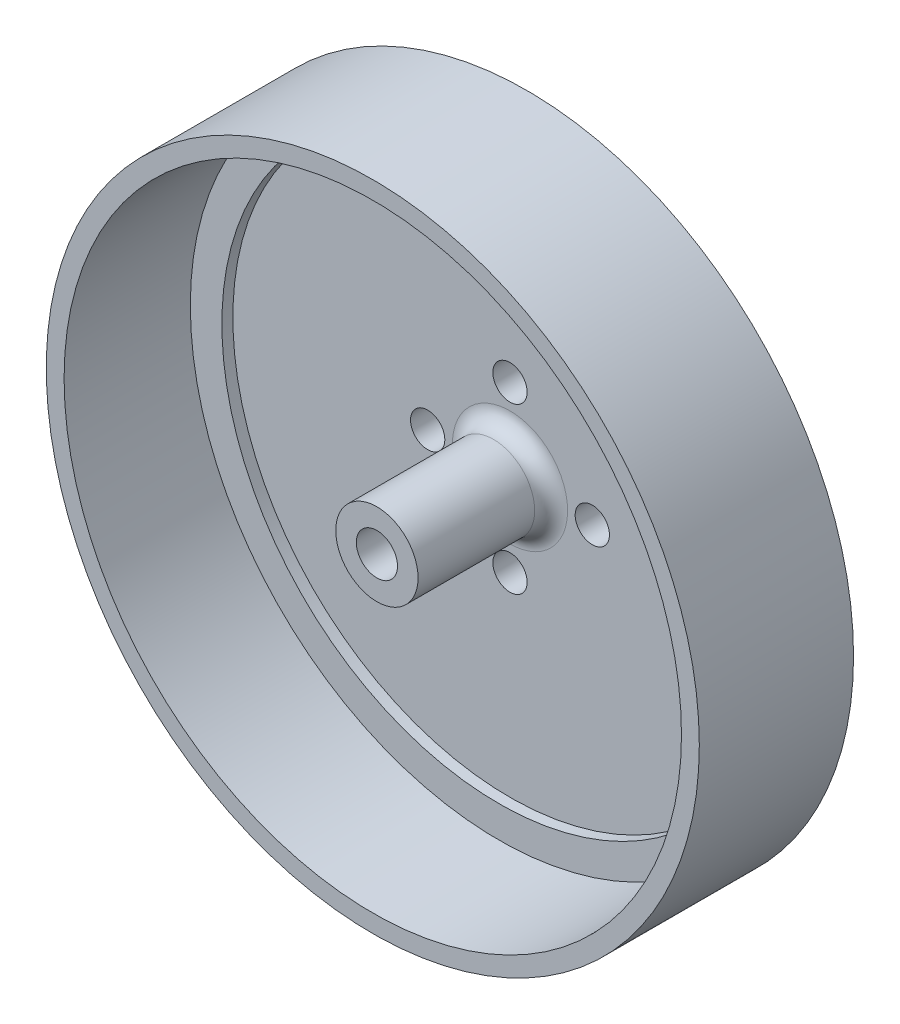
ISO-10303-21;
HEADER;
FILE_DESCRIPTION(('STEP AP214'),'2;1');
FILE_NAME('part.step','',(''),(''),'','','');
FILE_SCHEMA(('AUTOMOTIVE_DESIGN { 1 0 10303 214 1 1 1 1 }'));
ENDSEC;
DATA;
#1=APPLICATION_CONTEXT('core data for automotive mechanical design processes');
#2=APPLICATION_PROTOCOL_DEFINITION('international standard','automotive_design',2000,#1);
#3=PRODUCT_CONTEXT('',#1,'mechanical');
#4=PRODUCT('Part','Part','',(#3));
#5=PRODUCT_RELATED_PRODUCT_CATEGORY('part','',(#4));
#6=PRODUCT_DEFINITION_FORMATION('','',#4);
#7=PRODUCT_DEFINITION_CONTEXT('part definition',#1,'design');
#8=PRODUCT_DEFINITION('design','',#6,#7);
#9=PRODUCT_DEFINITION_SHAPE('','',#8);
#10=(LENGTH_UNIT() NAMED_UNIT(*) SI_UNIT(.MILLI.,.METRE.));
#11=(NAMED_UNIT(*) PLANE_ANGLE_UNIT() SI_UNIT($,.RADIAN.));
#12=(NAMED_UNIT(*) SI_UNIT($,.STERADIAN.) SOLID_ANGLE_UNIT());
#13=UNCERTAINTY_MEASURE_WITH_UNIT(LENGTH_MEASURE(1.E-05),#10,'distance_accuracy_value','');
#14=(GEOMETRIC_REPRESENTATION_CONTEXT(3) GLOBAL_UNCERTAINTY_ASSIGNED_CONTEXT((#13)) GLOBAL_UNIT_ASSIGNED_CONTEXT((#10,
#11,#12)) REPRESENTATION_CONTEXT('',''));
#15=CARTESIAN_POINT('',(0.,0.,0.));
#16=DIRECTION('',(0.,0.,1.));
#17=DIRECTION('',(1.,0.,0.));
#18=AXIS2_PLACEMENT_3D('',#15,#16,#17);
#19=CARTESIAN_POINT('',(0.,0.,12.3));
#20=DIRECTION('',(0.,0.,-1.));
#21=DIRECTION('',(-1.,0.,0.));
#22=AXIS2_PLACEMENT_3D('',#19,#20,#21);
#23=CYLINDRICAL_SURFACE('',#22,20.2);
#24=CARTESIAN_POINT('',(0.,0.,2.3));
#25=DIRECTION('',(0.,0.,1.));
#26=DIRECTION('',(1.,0.,0.));
#27=AXIS2_PLACEMENT_3D('',#24,#25,#26);
#28=CIRCLE('',#27,20.2);
#29=CARTESIAN_POINT('',(20.2,0.,2.3));
#30=VERTEX_POINT('',#29);
#31=EDGE_CURVE('E73',#30,#30,#28,.F.);
#32=ORIENTED_EDGE('',*,*,#31,.T.);
#33=EDGE_LOOP('',(#32));
#34=FACE_BOUND('',#33,.T.);
#35=CARTESIAN_POINT('',(0.,0.,3.1));
#36=DIRECTION('',(0.,0.,1.));
#37=DIRECTION('',(1.,0.,0.));
#38=AXIS2_PLACEMENT_3D('',#35,#36,#37);
#39=CIRCLE('',#38,20.2);
#40=CARTESIAN_POINT('',(20.2,0.,3.1));
#41=VERTEX_POINT('',#40);
#42=EDGE_CURVE('E53',#41,#41,#39,.T.);
#43=ORIENTED_EDGE('',*,*,#42,.T.);
#44=EDGE_LOOP('',(#43));
#45=FACE_BOUND('',#44,.T.);
#46=ADVANCED_FACE('F33',(#34,#45),#23,.F.);
#47=CARTESIAN_POINT('',(0.,0.,2.3));
#48=DIRECTION('',(0.,0.,-1.));
#49=DIRECTION('',(-1.,0.,0.));
#50=AXIS2_PLACEMENT_3D('',#47,#48,#49);
#51=CYLINDRICAL_SURFACE('',#50,23.8);
#52=CARTESIAN_POINT('',(0.,0.,1.05796188425079));
#53=DIRECTION('',(0.,0.,1.));
#54=DIRECTION('',(1.,0.,0.));
#55=AXIS2_PLACEMENT_3D('',#52,#53,#54);
#56=CIRCLE('',#55,23.8);
#57=CARTESIAN_POINT('',(23.8,0.,1.05796188425079));
#58=VERTEX_POINT('',#57);
#59=EDGE_CURVE('E76',#58,#58,#56,.T.);
#60=ORIENTED_EDGE('',*,*,#59,.T.);
#61=EDGE_LOOP('',(#60));
#62=FACE_BOUND('',#61,.T.);
#63=CARTESIAN_POINT('',(0.,0.,12.3));
#64=DIRECTION('',(0.,0.,1.));
#65=DIRECTION('',(1.,0.,0.));
#66=AXIS2_PLACEMENT_3D('',#63,#64,#65);
#67=CIRCLE('',#66,23.8);
#68=CARTESIAN_POINT('',(23.8,0.,12.3));
#69=VERTEX_POINT('',#68);
#70=EDGE_CURVE('E69',#69,#69,#67,.T.);
#71=ORIENTED_EDGE('',*,*,#70,.F.);
#72=EDGE_LOOP('',(#71));
#73=FACE_BOUND('',#72,.T.);
#74=ADVANCED_FACE('F113',(#62,#73),#51,.T.);
#75=CARTESIAN_POINT('',(0.,0.,0.));
#76=DIRECTION('',(0.,0.,1.));
#77=DIRECTION('',(1.,0.,0.));
#78=AXIS2_PLACEMENT_3D('',#75,#76,#77);
#79=PLANE('',#78);
#80=CARTESIAN_POINT('',(0.,0.,0.));
#81=DIRECTION('',(0.,0.,-1.));
#82=DIRECTION('',(-1.,0.,0.));
#83=AXIS2_PLACEMENT_3D('',#80,#81,#82);
#84=CIRCLE('',#83,9.33925413639657);
#85=CARTESIAN_POINT('',(-9.33925413639657,0.,0.));
#86=VERTEX_POINT('',#85);
#87=EDGE_CURVE('E10',#86,#86,#84,.T.);
#88=ORIENTED_EDGE('',*,*,#87,.F.);
#89=EDGE_LOOP('',(#88));
#90=FACE_BOUND('',#89,.T.);
#91=CARTESIAN_POINT('',(0.,0.,0.));
#92=DIRECTION('',(0.,0.,1.));
#93=DIRECTION('',(1.,0.,0.));
#94=AXIS2_PLACEMENT_3D('',#91,#92,#93);
#95=CIRCLE('',#94,17.7999999999999);
#96=CARTESIAN_POINT('',(17.7999999999999,0.,0.));
#97=VERTEX_POINT('',#96);
#98=EDGE_CURVE('E79',#97,#97,#95,.F.);
#99=ORIENTED_EDGE('',*,*,#98,.T.);
#100=EDGE_LOOP('',(#99));
#101=FACE_BOUND('',#100,.T.);
#102=ADVANCED_FACE('F119',(#90,#101),#79,.F.);
#103=CARTESIAN_POINT('',(0.,0.,12.3));
#104=DIRECTION('',(0.,0.,1.));
#105=DIRECTION('',(1.,0.,0.));
#106=AXIS2_PLACEMENT_3D('',#103,#104,#105);
#107=PLANE('',#106);
#108=CARTESIAN_POINT('',(0.,0.,12.3));
#109=DIRECTION('',(0.,0.,1.));
#110=DIRECTION('',(1.,0.,0.));
#111=AXIS2_PLACEMENT_3D('',#108,#109,#110);
#112=CIRCLE('',#111,22.5);
#113=CARTESIAN_POINT('',(22.5,0.,12.3));
#114=VERTEX_POINT('',#113);
#115=EDGE_CURVE('E59',#114,#114,#112,.T.);
#116=ORIENTED_EDGE('',*,*,#115,.F.);
#117=EDGE_LOOP('',(#116));
#118=FACE_BOUND('',#117,.T.);
#119=ORIENTED_EDGE('',*,*,#70,.T.);
#120=EDGE_LOOP('',(#119));
#121=FACE_BOUND('',#120,.T.);
#122=ADVANCED_FACE('F126',(#118,#121),#107,.T.);
#123=CARTESIAN_POINT('',(0.,0.,2.3));
#124=DIRECTION('',(0.,0.,1.));
#125=DIRECTION('',(1.,0.,0.));
#126=AXIS2_PLACEMENT_3D('',#123,#124,#125);
#127=PLANE('',#126);
#128=CARTESIAN_POINT('',(0.,0.,2.3));
#129=DIRECTION('',(0.,0.,1.));
#130=DIRECTION('',(1.,0.,0.));
#131=AXIS2_PLACEMENT_3D('',#128,#129,#130);
#132=CIRCLE('',#131,4.2);
#133=CARTESIAN_POINT('',(4.2,0.,2.3));
#134=VERTEX_POINT('',#133);
#135=EDGE_CURVE('E37',#134,#134,#132,.F.);
#136=ORIENTED_EDGE('',*,*,#135,.T.);
#137=EDGE_LOOP('',(#136));
#138=FACE_BOUND('',#137,.T.);
#139=CARTESIAN_POINT('',(-6.,0.,2.3));
#140=DIRECTION('',(0.,0.,1.));
#141=DIRECTION('',(1.,0.,0.));
#142=AXIS2_PLACEMENT_3D('',#139,#140,#141);
#143=CIRCLE('',#142,1.25);
#144=CARTESIAN_POINT('',(-4.75,0.,2.3));
#145=VERTEX_POINT('',#144);
#146=EDGE_CURVE('E70',#145,#145,#143,.T.);
#147=ORIENTED_EDGE('',*,*,#146,.F.);
#148=EDGE_LOOP('',(#147));
#149=FACE_BOUND('',#148,.T.);
#150=CARTESIAN_POINT('',(0.,-6.,2.3));
#151=DIRECTION('',(0.,0.,1.));
#152=DIRECTION('',(1.,0.,0.));
#153=AXIS2_PLACEMENT_3D('',#150,#151,#152);
#154=CIRCLE('',#153,1.25);
#155=CARTESIAN_POINT('',(1.25000000000002,-6.,2.3));
#156=VERTEX_POINT('',#155);
#157=EDGE_CURVE('E87',#156,#156,#154,.T.);
#158=ORIENTED_EDGE('',*,*,#157,.F.);
#159=EDGE_LOOP('',(#158));
#160=FACE_BOUND('',#159,.T.);
#161=CARTESIAN_POINT('',(6.,0.,2.3));
#162=DIRECTION('',(0.,0.,1.));
#163=DIRECTION('',(1.,0.,0.));
#164=AXIS2_PLACEMENT_3D('',#161,#162,#163);
#165=CIRCLE('',#164,1.25);
#166=CARTESIAN_POINT('',(7.25,0.,2.3));
#167=VERTEX_POINT('',#166);
#168=EDGE_CURVE('E84',#167,#167,#165,.T.);
#169=ORIENTED_EDGE('',*,*,#168,.F.);
#170=EDGE_LOOP('',(#169));
#171=FACE_BOUND('',#170,.T.);
#172=CARTESIAN_POINT('',(0.,6.,2.3));
#173=DIRECTION('',(0.,0.,1.));
#174=DIRECTION('',(1.,0.,0.));
#175=AXIS2_PLACEMENT_3D('',#172,#173,#174);
#176=CIRCLE('',#175,1.25);
#177=CARTESIAN_POINT('',(1.24999999999994,6.,2.3));
#178=VERTEX_POINT('',#177);
#179=EDGE_CURVE('E63',#178,#178,#176,.T.);
#180=ORIENTED_EDGE('',*,*,#179,.F.);
#181=EDGE_LOOP('',(#180));
#182=FACE_BOUND('',#181,.T.);
#183=ORIENTED_EDGE('',*,*,#31,.F.);
#184=EDGE_LOOP('',(#183));
#185=FACE_BOUND('',#184,.T.);
#186=ADVANCED_FACE('F129',(#138,#149,#160,#171,#182,#185),#127,.T.);
#187=CARTESIAN_POINT('',(0.,0.,12.));
#188=DIRECTION('',(0.,0.,-1.));
#189=DIRECTION('',(-1.,0.,0.));
#190=AXIS2_PLACEMENT_3D('',#187,#188,#189);
#191=CYLINDRICAL_SURFACE('',#190,3.);
#192=CARTESIAN_POINT('',(0.,0.,3.5));
#193=DIRECTION('',(0.,0.,1.));
#194=DIRECTION('',(1.,0.,0.));
#195=AXIS2_PLACEMENT_3D('',#192,#193,#194);
#196=CIRCLE('',#195,3.);
#197=CARTESIAN_POINT('',(3.,0.,3.5));
#198=VERTEX_POINT('',#197);
#199=EDGE_CURVE('E45',#198,#198,#196,.T.);
#200=ORIENTED_EDGE('',*,*,#199,.T.);
#201=EDGE_LOOP('',(#200));
#202=FACE_BOUND('',#201,.T.);
#203=CARTESIAN_POINT('',(0.,0.,12.));
#204=DIRECTION('',(0.,0.,1.));
#205=DIRECTION('',(1.,0.,0.));
#206=AXIS2_PLACEMENT_3D('',#203,#204,#205);
#207=CIRCLE('',#206,3.);
#208=CARTESIAN_POINT('',(3.,0.,12.));
#209=VERTEX_POINT('',#208);
#210=EDGE_CURVE('E66',#209,#209,#207,.T.);
#211=ORIENTED_EDGE('',*,*,#210,.F.);
#212=EDGE_LOOP('',(#211));
#213=FACE_BOUND('',#212,.T.);
#214=ADVANCED_FACE('F94',(#202,#213),#191,.T.);
#215=CARTESIAN_POINT('',(0.,0.,12.));
#216=DIRECTION('',(0.,0.,1.));
#217=DIRECTION('',(1.,0.,0.));
#218=AXIS2_PLACEMENT_3D('',#215,#216,#217);
#219=PLANE('',#218);
#220=CARTESIAN_POINT('',(0.,0.,12.));
#221=DIRECTION('',(0.,0.,1.));
#222=DIRECTION('',(1.,0.,0.));
#223=AXIS2_PLACEMENT_3D('',#220,#221,#222);
#224=CIRCLE('',#223,1.5);
#225=CARTESIAN_POINT('',(1.5,0.,12.));
#226=VERTEX_POINT('',#225);
#227=EDGE_CURVE('E54',#226,#226,#224,.T.);
#228=ORIENTED_EDGE('',*,*,#227,.F.);
#229=EDGE_LOOP('',(#228));
#230=FACE_BOUND('',#229,.T.);
#231=ORIENTED_EDGE('',*,*,#210,.T.);
#232=EDGE_LOOP('',(#231));
#233=FACE_BOUND('',#232,.T.);
#234=ADVANCED_FACE('F139',(#230,#233),#219,.T.);
#235=CARTESIAN_POINT('',(0.,0.,1.05796188425079));
#236=DIRECTION('',(0.,0.,1.));
#237=DIRECTION('',(1.,0.,0.));
#238=AXIS2_PLACEMENT_3D('',#235,#236,#237);
#239=CONICAL_SURFACE('',#238,23.8,1.39626340159547);
#240=ORIENTED_EDGE('',*,*,#98,.F.);
#241=EDGE_LOOP('',(#240));
#242=FACE_BOUND('',#241,.T.);
#243=ORIENTED_EDGE('',*,*,#59,.F.);
#244=EDGE_LOOP('',(#243));
#245=FACE_BOUND('',#244,.T.);
#246=ADVANCED_FACE('F136',(#242,#245),#239,.T.);
#247=CARTESIAN_POINT('',(0.,6.,15.));
#248=DIRECTION('',(0.,0.,-1.));
#249=DIRECTION('',(-1.,0.,0.));
#250=AXIS2_PLACEMENT_3D('',#247,#248,#249);
#251=CYLINDRICAL_SURFACE('',#250,1.25);
#252=ORIENTED_EDGE('',*,*,#179,.T.);
#253=EDGE_LOOP('',(#252));
#254=FACE_BOUND('',#253,.T.);
#255=CARTESIAN_POINT('',(0.,6.,-1.));
#256=DIRECTION('',(0.,0.,-1.));
#257=DIRECTION('',(-1.,0.,0.));
#258=AXIS2_PLACEMENT_3D('',#255,#256,#257);
#259=CIRCLE('',#258,1.25);
#260=CARTESIAN_POINT('',(-1.25000000000006,6.,-1.));
#261=VERTEX_POINT('',#260);
#262=EDGE_CURVE('E212',#261,#261,#259,.T.);
#263=ORIENTED_EDGE('',*,*,#262,.T.);
#264=EDGE_LOOP('',(#263));
#265=FACE_BOUND('',#264,.T.);
#266=ADVANCED_FACE('F138',(#254,#265),#251,.F.);
#267=CARTESIAN_POINT('',(6.,0.,15.));
#268=DIRECTION('',(0.,0.,-1.));
#269=DIRECTION('',(-1.,0.,0.));
#270=AXIS2_PLACEMENT_3D('',#267,#268,#269);
#271=CYLINDRICAL_SURFACE('',#270,1.25);
#272=ORIENTED_EDGE('',*,*,#168,.T.);
#273=EDGE_LOOP('',(#272));
#274=FACE_BOUND('',#273,.T.);
#275=CARTESIAN_POINT('',(6.,0.,-1.));
#276=DIRECTION('',(0.,0.,-1.));
#277=DIRECTION('',(-1.,0.,0.));
#278=AXIS2_PLACEMENT_3D('',#275,#276,#277);
#279=CIRCLE('',#278,1.25);
#280=CARTESIAN_POINT('',(4.75,0.,-1.));
#281=VERTEX_POINT('',#280);
#282=EDGE_CURVE('E199',#281,#281,#279,.T.);
#283=ORIENTED_EDGE('',*,*,#282,.T.);
#284=EDGE_LOOP('',(#283));
#285=FACE_BOUND('',#284,.T.);
#286=ADVANCED_FACE('F145',(#274,#285),#271,.F.);
#287=CARTESIAN_POINT('',(0.,-6.,15.));
#288=DIRECTION('',(0.,0.,-1.));
#289=DIRECTION('',(-1.,0.,0.));
#290=AXIS2_PLACEMENT_3D('',#287,#288,#289);
#291=CYLINDRICAL_SURFACE('',#290,1.25);
#292=ORIENTED_EDGE('',*,*,#157,.T.);
#293=EDGE_LOOP('',(#292));
#294=FACE_BOUND('',#293,.T.);
#295=CARTESIAN_POINT('',(0.,-6.,-1.));
#296=DIRECTION('',(0.,0.,-1.));
#297=DIRECTION('',(-1.,0.,0.));
#298=AXIS2_PLACEMENT_3D('',#295,#296,#297);
#299=CIRCLE('',#298,1.25);
#300=CARTESIAN_POINT('',(-1.24999999999998,-6.,-1.));
#301=VERTEX_POINT('',#300);
#302=EDGE_CURVE('E203',#301,#301,#299,.T.);
#303=ORIENTED_EDGE('',*,*,#302,.T.);
#304=EDGE_LOOP('',(#303));
#305=FACE_BOUND('',#304,.T.);
#306=ADVANCED_FACE('F164',(#294,#305),#291,.F.);
#307=CARTESIAN_POINT('',(-6.,0.,15.));
#308=DIRECTION('',(0.,0.,-1.));
#309=DIRECTION('',(-1.,0.,0.));
#310=AXIS2_PLACEMENT_3D('',#307,#308,#309);
#311=CYLINDRICAL_SURFACE('',#310,1.25);
#312=ORIENTED_EDGE('',*,*,#146,.T.);
#313=EDGE_LOOP('',(#312));
#314=FACE_BOUND('',#313,.T.);
#315=CARTESIAN_POINT('',(-6.,0.,-1.));
#316=DIRECTION('',(0.,0.,-1.));
#317=DIRECTION('',(-1.,0.,0.));
#318=AXIS2_PLACEMENT_3D('',#315,#316,#317);
#319=CIRCLE('',#318,1.25);
#320=CARTESIAN_POINT('',(-7.25,0.,-1.));
#321=VERTEX_POINT('',#320);
#322=EDGE_CURVE('E210',#321,#321,#319,.T.);
#323=ORIENTED_EDGE('',*,*,#322,.T.);
#324=EDGE_LOOP('',(#323));
#325=FACE_BOUND('',#324,.T.);
#326=ADVANCED_FACE('F168',(#314,#325),#311,.F.);
#327=CARTESIAN_POINT('',(0.,0.,3.1));
#328=DIRECTION('',(0.,0.,1.));
#329=DIRECTION('',(1.,0.,0.));
#330=AXIS2_PLACEMENT_3D('',#327,#328,#329);
#331=CYLINDRICAL_SURFACE('',#330,22.5);
#332=CARTESIAN_POINT('',(0.,0.,3.1));
#333=DIRECTION('',(0.,0.,1.));
#334=DIRECTION('',(1.,0.,0.));
#335=AXIS2_PLACEMENT_3D('',#332,#333,#334);
#336=CIRCLE('',#335,22.5);
#337=CARTESIAN_POINT('',(22.5,0.,3.1));
#338=VERTEX_POINT('',#337);
#339=EDGE_CURVE('E60',#338,#338,#336,.T.);
#340=ORIENTED_EDGE('',*,*,#339,.F.);
#341=EDGE_LOOP('',(#340));
#342=FACE_BOUND('',#341,.T.);
#343=ORIENTED_EDGE('',*,*,#115,.T.);
#344=EDGE_LOOP('',(#343));
#345=FACE_BOUND('',#344,.T.);
#346=ADVANCED_FACE('F172',(#342,#345),#331,.F.);
#347=CARTESIAN_POINT('',(0.,0.,3.1));
#348=DIRECTION('',(0.,0.,1.));
#349=DIRECTION('',(1.,0.,0.));
#350=AXIS2_PLACEMENT_3D('',#347,#348,#349);
#351=PLANE('',#350);
#352=ORIENTED_EDGE('',*,*,#42,.F.);
#353=EDGE_LOOP('',(#352));
#354=FACE_BOUND('',#353,.T.);
#355=ORIENTED_EDGE('',*,*,#339,.T.);
#356=EDGE_LOOP('',(#355));
#357=FACE_BOUND('',#356,.T.);
#358=ADVANCED_FACE('F176',(#354,#357),#351,.T.);
#359=CARTESIAN_POINT('',(0.,0.,7.));
#360=DIRECTION('',(0.,0.,1.));
#361=DIRECTION('',(1.,0.,0.));
#362=AXIS2_PLACEMENT_3D('',#359,#360,#361);
#363=CYLINDRICAL_SURFACE('',#362,1.5);
#364=CARTESIAN_POINT('',(0.,0.,7.));
#365=DIRECTION('',(0.,0.,1.));
#366=DIRECTION('',(1.,0.,0.));
#367=AXIS2_PLACEMENT_3D('',#364,#365,#366);
#368=CIRCLE('',#367,1.5);
#369=CARTESIAN_POINT('',(1.5,0.,7.));
#370=VERTEX_POINT('',#369);
#371=EDGE_CURVE('E50',#370,#370,#368,.T.);
#372=ORIENTED_EDGE('',*,*,#371,.F.);
#373=EDGE_LOOP('',(#372));
#374=FACE_BOUND('',#373,.T.);
#375=ORIENTED_EDGE('',*,*,#227,.T.);
#376=EDGE_LOOP('',(#375));
#377=FACE_BOUND('',#376,.T.);
#378=ADVANCED_FACE('F108',(#374,#377),#363,.F.);
#379=CARTESIAN_POINT('',(0.,0.,7.));
#380=DIRECTION('',(0.,0.,1.));
#381=DIRECTION('',(1.,0.,0.));
#382=AXIS2_PLACEMENT_3D('',#379,#380,#381);
#383=PLANE('',#382);
#384=ORIENTED_EDGE('',*,*,#371,.T.);
#385=EDGE_LOOP('',(#384));
#386=FACE_BOUND('',#385,.T.);
#387=ADVANCED_FACE('F99',(#386),#383,.T.);
#388=CARTESIAN_POINT('',(0.,0.,3.5));
#389=DIRECTION('',(0.,0.,1.));
#390=DIRECTION('',(1.,0.,0.));
#391=AXIS2_PLACEMENT_3D('',#388,#389,#390);
#392=TOROIDAL_SURFACE('',#391,4.2,1.2);
#393=ORIENTED_EDGE('',*,*,#135,.F.);
#394=EDGE_LOOP('',(#393));
#395=FACE_BOUND('',#394,.T.);
#396=ORIENTED_EDGE('',*,*,#199,.F.);
#397=EDGE_LOOP('',(#396));
#398=FACE_BOUND('',#397,.T.);
#399=ADVANCED_FACE('F35',(#395,#398),#392,.F.);
#400=CARTESIAN_POINT('',(0.,0.,-1.));
#401=DIRECTION('',(0.,0.,-1.));
#402=DIRECTION('',(-1.,0.,0.));
#403=AXIS2_PLACEMENT_3D('',#400,#401,#402);
#404=PLANE('',#403);
#405=CARTESIAN_POINT('',(0.,0.,-1.));
#406=DIRECTION('',(0.,0.,-1.));
#407=DIRECTION('',(-1.,0.,0.));
#408=AXIS2_PLACEMENT_3D('',#405,#406,#407);
#409=CIRCLE('',#408,2.);
#410=CARTESIAN_POINT('',(-2.,0.,-1.));
#411=VERTEX_POINT('',#410);
#412=EDGE_CURVE('E200',#411,#411,#409,.T.);
#413=ORIENTED_EDGE('',*,*,#412,.F.);
#414=EDGE_LOOP('',(#413));
#415=FACE_BOUND('',#414,.T.);
#416=ORIENTED_EDGE('',*,*,#302,.F.);
#417=EDGE_LOOP('',(#416));
#418=FACE_BOUND('',#417,.T.);
#419=ORIENTED_EDGE('',*,*,#262,.F.);
#420=EDGE_LOOP('',(#419));
#421=FACE_BOUND('',#420,.T.);
#422=CARTESIAN_POINT('',(0.,0.,-1.));
#423=DIRECTION('',(0.,0.,-1.));
#424=DIRECTION('',(-1.,0.,0.));
#425=AXIS2_PLACEMENT_3D('',#422,#423,#424);
#426=CIRCLE('',#425,9.33925413639657);
#427=CARTESIAN_POINT('',(-9.33925413639657,0.,-1.));
#428=VERTEX_POINT('',#427);
#429=EDGE_CURVE('E48',#428,#428,#426,.T.);
#430=ORIENTED_EDGE('',*,*,#429,.T.);
#431=EDGE_LOOP('',(#430));
#432=FACE_BOUND('',#431,.T.);
#433=ORIENTED_EDGE('',*,*,#322,.F.);
#434=EDGE_LOOP('',(#433));
#435=FACE_BOUND('',#434,.T.);
#436=ORIENTED_EDGE('',*,*,#282,.F.);
#437=EDGE_LOOP('',(#436));
#438=FACE_BOUND('',#437,.T.);
#439=ADVANCED_FACE('F98',(#415,#418,#421,#432,#435,#438),#404,.T.);
#440=CARTESIAN_POINT('',(0.,0.,-1.));
#441=DIRECTION('',(0.,0.,1.));
#442=DIRECTION('',(1.,0.,0.));
#443=AXIS2_PLACEMENT_3D('',#440,#441,#442);
#444=CYLINDRICAL_SURFACE('',#443,9.33925413639657);
#445=ORIENTED_EDGE('',*,*,#429,.F.);
#446=EDGE_LOOP('',(#445));
#447=FACE_BOUND('',#446,.T.);
#448=ORIENTED_EDGE('',*,*,#87,.T.);
#449=EDGE_LOOP('',(#448));
#450=FACE_BOUND('',#449,.T.);
#451=ADVANCED_FACE('F105',(#447,#450),#444,.T.);
#452=CARTESIAN_POINT('',(0.,0.,-4.));
#453=DIRECTION('',(0.,0.,1.));
#454=DIRECTION('',(1.,0.,0.));
#455=AXIS2_PLACEMENT_3D('',#452,#453,#454);
#456=CYLINDRICAL_SURFACE('',#455,2.);
#457=CARTESIAN_POINT('',(0.,0.,-4.));
#458=DIRECTION('',(0.,0.,-1.));
#459=DIRECTION('',(-1.,0.,0.));
#460=AXIS2_PLACEMENT_3D('',#457,#458,#459);
#461=CIRCLE('',#460,2.);
#462=CARTESIAN_POINT('',(-2.,0.,-4.));
#463=VERTEX_POINT('',#462);
#464=EDGE_CURVE('E198',#463,#463,#461,.T.);
#465=ORIENTED_EDGE('',*,*,#464,.F.);
#466=EDGE_LOOP('',(#465));
#467=FACE_BOUND('',#466,.T.);
#468=ORIENTED_EDGE('',*,*,#412,.T.);
#469=EDGE_LOOP('',(#468));
#470=FACE_BOUND('',#469,.T.);
#471=ADVANCED_FACE('F185',(#467,#470),#456,.T.);
#472=CARTESIAN_POINT('',(0.,0.,-4.));
#473=DIRECTION('',(0.,0.,-1.));
#474=DIRECTION('',(-1.,0.,0.));
#475=AXIS2_PLACEMENT_3D('',#472,#473,#474);
#476=PLANE('',#475);
#477=ORIENTED_EDGE('',*,*,#464,.T.);
#478=EDGE_LOOP('',(#477));
#479=FACE_BOUND('',#478,.T.);
#480=ADVANCED_FACE('F190',(#479),#476,.T.);
#481=CLOSED_SHELL('',(#46,#74,#102,#122,#186,#214,#234,#246,#266,#286,#306,#326,#346,#358,#378,
#387,#399,#439,#451,#471,#480));
#482=MANIFOLD_SOLID_BREP('B2',#481);
#483=ADVANCED_BREP_SHAPE_REPRESENTATION('',(#18,#482),#14);
#484=SHAPE_DEFINITION_REPRESENTATION(#9,#483);
ENDSEC;
END-ISO-10303-21;
